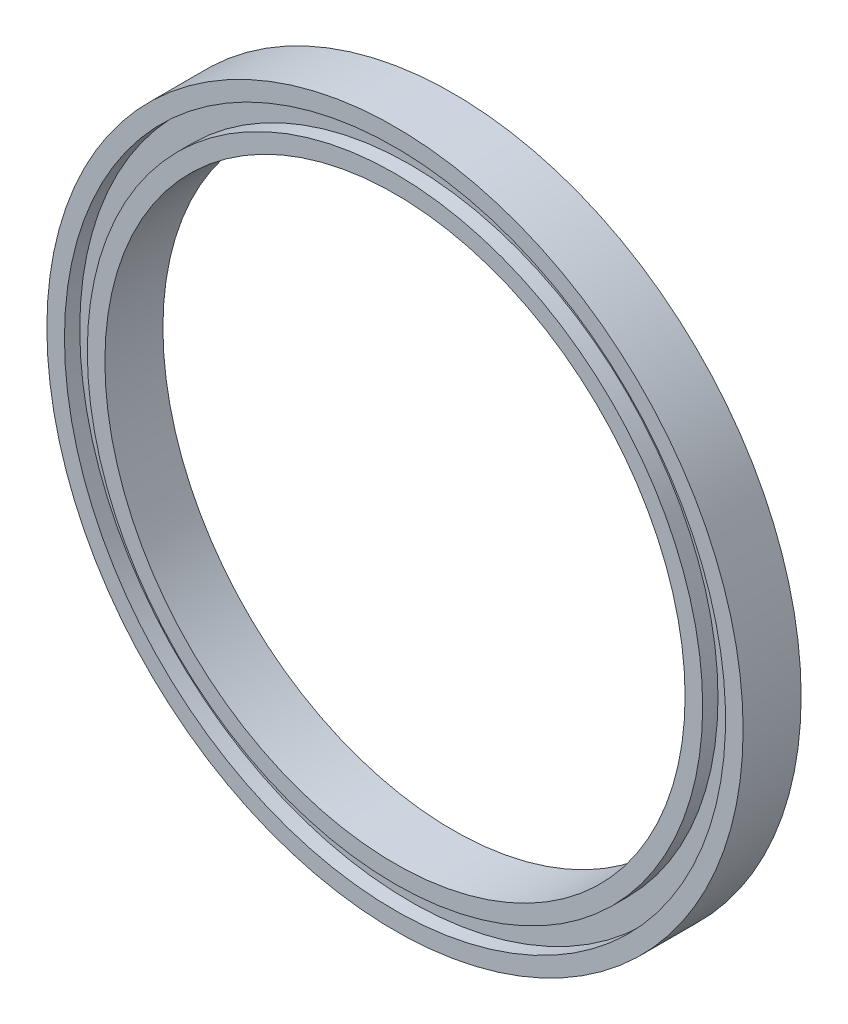
ISO-10303-21;
HEADER;
FILE_DESCRIPTION(('STEP AP214'),'2;1');
FILE_NAME('part.step','',(''),(''),'','','');
FILE_SCHEMA(('AUTOMOTIVE_DESIGN { 1 0 10303 214 1 1 1 1 }'));
ENDSEC;
DATA;
#1=APPLICATION_CONTEXT('core data for automotive mechanical design processes');
#2=APPLICATION_PROTOCOL_DEFINITION('international standard','automotive_design',2000,#1);
#3=PRODUCT_CONTEXT('',#1,'mechanical');
#4=PRODUCT('Part','Part','',(#3));
#5=PRODUCT_RELATED_PRODUCT_CATEGORY('part','',(#4));
#6=PRODUCT_DEFINITION_FORMATION('','',#4);
#7=PRODUCT_DEFINITION_CONTEXT('part definition',#1,'design');
#8=PRODUCT_DEFINITION('design','',#6,#7);
#9=PRODUCT_DEFINITION_SHAPE('','',#8);
#10=(LENGTH_UNIT() NAMED_UNIT(*) SI_UNIT(.MILLI.,.METRE.));
#11=(NAMED_UNIT(*) PLANE_ANGLE_UNIT() SI_UNIT($,.RADIAN.));
#12=(NAMED_UNIT(*) SI_UNIT($,.STERADIAN.) SOLID_ANGLE_UNIT());
#13=UNCERTAINTY_MEASURE_WITH_UNIT(LENGTH_MEASURE(1.E-05),#10,'distance_accuracy_value','');
#14=(GEOMETRIC_REPRESENTATION_CONTEXT(3) GLOBAL_UNCERTAINTY_ASSIGNED_CONTEXT((#13)) GLOBAL_UNIT_ASSIGNED_CONTEXT((#10,
#11,#12)) REPRESENTATION_CONTEXT('',''));
#15=CARTESIAN_POINT('',(0.,0.,0.));
#16=DIRECTION('',(0.,0.,1.));
#17=DIRECTION('',(1.,0.,0.));
#18=AXIS2_PLACEMENT_3D('',#15,#16,#17);
#19=CARTESIAN_POINT('',(0.,38.1,-3.175));
#20=DIRECTION('',(0.,0.,-1.));
#21=DIRECTION('',(-1.,0.,0.));
#22=AXIS2_PLACEMENT_3D('',#19,#20,#21);
#23=PLANE('',#22);
#24=CARTESIAN_POINT('',(0.,0.,-3.175));
#25=DIRECTION('',(0.,0.,-1.));
#26=DIRECTION('',(-1.,0.,0.));
#27=AXIS2_PLACEMENT_3D('',#24,#25,#26);
#28=CIRCLE('',#27,38.1);
#29=CARTESIAN_POINT('',(-38.1,0.,-3.175));
#30=VERTEX_POINT('',#29);
#31=EDGE_CURVE('E85',#30,#30,#28,.T.);
#32=ORIENTED_EDGE('',*,*,#31,.T.);
#33=EDGE_LOOP('',(#32));
#34=FACE_BOUND('',#33,.T.);
#35=CARTESIAN_POINT('',(0.,0.,-3.175));
#36=DIRECTION('',(0.,0.,-1.));
#37=DIRECTION('',(-1.,0.,0.));
#38=AXIS2_PLACEMENT_3D('',#35,#36,#37);
#39=CIRCLE('',#38,36.175);
#40=CARTESIAN_POINT('',(-36.175,0.,-3.175));
#41=VERTEX_POINT('',#40);
#42=EDGE_CURVE('E10',#41,#41,#39,.T.);
#43=ORIENTED_EDGE('',*,*,#42,.F.);
#44=EDGE_LOOP('',(#43));
#45=FACE_BOUND('',#44,.T.);
#46=ADVANCED_FACE('F45',(#34,#45),#23,.T.);
#47=CARTESIAN_POINT('',(0.,0.,0.));
#48=DIRECTION('',(0.,0.,-1.));
#49=DIRECTION('',(-1.,0.,0.));
#50=AXIS2_PLACEMENT_3D('',#47,#48,#49);
#51=CYLINDRICAL_SURFACE('',#50,36.175);
#52=ORIENTED_EDGE('',*,*,#42,.T.);
#53=EDGE_LOOP('',(#52));
#54=FACE_BOUND('',#53,.T.);
#55=CARTESIAN_POINT('',(0.,0.,-1.5));
#56=DIRECTION('',(0.,0.,-1.));
#57=DIRECTION('',(-1.,0.,0.));
#58=AXIS2_PLACEMENT_3D('',#55,#56,#57);
#59=CIRCLE('',#58,36.175);
#60=CARTESIAN_POINT('',(-36.175,0.,-1.5));
#61=VERTEX_POINT('',#60);
#62=EDGE_CURVE('E51',#61,#61,#59,.T.);
#63=ORIENTED_EDGE('',*,*,#62,.F.);
#64=EDGE_LOOP('',(#63));
#65=FACE_BOUND('',#64,.T.);
#66=ADVANCED_FACE('F103',(#54,#65),#51,.F.);
#67=CARTESIAN_POINT('',(0.,36.175,-1.5));
#68=DIRECTION('',(0.,0.,-1.));
#69=DIRECTION('',(-1.,0.,0.));
#70=AXIS2_PLACEMENT_3D('',#67,#68,#69);
#71=PLANE('',#70);
#72=ORIENTED_EDGE('',*,*,#62,.T.);
#73=EDGE_LOOP('',(#72));
#74=FACE_BOUND('',#73,.T.);
#75=CARTESIAN_POINT('',(0.,0.,-1.5));
#76=DIRECTION('',(0.,0.,-1.));
#77=DIRECTION('',(-1.,0.,0.));
#78=AXIS2_PLACEMENT_3D('',#75,#76,#77);
#79=CIRCLE('',#78,33.675);
#80=CARTESIAN_POINT('',(-33.675,0.,-1.5));
#81=VERTEX_POINT('',#80);
#82=EDGE_CURVE('E55',#81,#81,#79,.T.);
#83=ORIENTED_EDGE('',*,*,#82,.F.);
#84=EDGE_LOOP('',(#83));
#85=FACE_BOUND('',#84,.T.);
#86=ADVANCED_FACE('F107',(#74,#85),#71,.T.);
#87=CARTESIAN_POINT('',(0.,0.,0.));
#88=DIRECTION('',(0.,0.,-1.));
#89=DIRECTION('',(-1.,0.,0.));
#90=AXIS2_PLACEMENT_3D('',#87,#88,#89);
#91=CYLINDRICAL_SURFACE('',#90,33.675);
#92=ORIENTED_EDGE('',*,*,#82,.T.);
#93=EDGE_LOOP('',(#92));
#94=FACE_BOUND('',#93,.T.);
#95=CARTESIAN_POINT('',(0.,0.,-3.175));
#96=DIRECTION('',(0.,0.,-1.));
#97=DIRECTION('',(-1.,0.,0.));
#98=AXIS2_PLACEMENT_3D('',#95,#96,#97);
#99=CIRCLE('',#98,33.675);
#100=CARTESIAN_POINT('',(-33.675,0.,-3.175));
#101=VERTEX_POINT('',#100);
#102=EDGE_CURVE('E59',#101,#101,#99,.T.);
#103=ORIENTED_EDGE('',*,*,#102,.F.);
#104=EDGE_LOOP('',(#103));
#105=FACE_BOUND('',#104,.T.);
#106=ADVANCED_FACE('F112',(#94,#105),#91,.T.);
#107=CARTESIAN_POINT('',(0.,31.75,-3.175));
#108=DIRECTION('',(0.,0.,-1.));
#109=DIRECTION('',(-1.,0.,0.));
#110=AXIS2_PLACEMENT_3D('',#107,#108,#109);
#111=PLANE('',#110);
#112=ORIENTED_EDGE('',*,*,#102,.T.);
#113=EDGE_LOOP('',(#112));
#114=FACE_BOUND('',#113,.T.);
#115=CARTESIAN_POINT('',(0.,0.,-3.175));
#116=DIRECTION('',(0.,0.,-1.));
#117=DIRECTION('',(-1.,0.,0.));
#118=AXIS2_PLACEMENT_3D('',#115,#116,#117);
#119=CIRCLE('',#118,31.75);
#120=CARTESIAN_POINT('',(-31.75,0.,-3.175));
#121=VERTEX_POINT('',#120);
#122=EDGE_CURVE('E64',#121,#121,#119,.T.);
#123=ORIENTED_EDGE('',*,*,#122,.F.);
#124=EDGE_LOOP('',(#123));
#125=FACE_BOUND('',#124,.T.);
#126=ADVANCED_FACE('F118',(#114,#125),#111,.T.);
#127=CARTESIAN_POINT('',(0.,0.,0.));
#128=DIRECTION('',(0.,0.,-1.));
#129=DIRECTION('',(-1.,0.,0.));
#130=AXIS2_PLACEMENT_3D('',#127,#128,#129);
#131=CYLINDRICAL_SURFACE('',#130,31.75);
#132=ORIENTED_EDGE('',*,*,#122,.T.);
#133=EDGE_LOOP('',(#132));
#134=FACE_BOUND('',#133,.T.);
#135=CARTESIAN_POINT('',(0.,0.,3.175));
#136=DIRECTION('',(0.,0.,-1.));
#137=DIRECTION('',(-1.,0.,0.));
#138=AXIS2_PLACEMENT_3D('',#135,#136,#137);
#139=CIRCLE('',#138,31.75);
#140=CARTESIAN_POINT('',(-31.75,0.,3.175));
#141=VERTEX_POINT('',#140);
#142=EDGE_CURVE('E67',#141,#141,#139,.T.);
#143=ORIENTED_EDGE('',*,*,#142,.F.);
#144=EDGE_LOOP('',(#143));
#145=FACE_BOUND('',#144,.T.);
#146=ADVANCED_FACE('F122',(#134,#145),#131,.F.);
#147=CARTESIAN_POINT('',(0.,31.75,3.175));
#148=DIRECTION('',(0.,0.,1.));
#149=DIRECTION('',(1.,0.,0.));
#150=AXIS2_PLACEMENT_3D('',#147,#148,#149);
#151=PLANE('',#150);
#152=ORIENTED_EDGE('',*,*,#142,.T.);
#153=EDGE_LOOP('',(#152));
#154=FACE_BOUND('',#153,.T.);
#155=CARTESIAN_POINT('',(0.,0.,3.175));
#156=DIRECTION('',(0.,0.,-1.));
#157=DIRECTION('',(-1.,0.,0.));
#158=AXIS2_PLACEMENT_3D('',#155,#156,#157);
#159=CIRCLE('',#158,33.675);
#160=CARTESIAN_POINT('',(-33.675,0.,3.175));
#161=VERTEX_POINT('',#160);
#162=EDGE_CURVE('E70',#161,#161,#159,.T.);
#163=ORIENTED_EDGE('',*,*,#162,.F.);
#164=EDGE_LOOP('',(#163));
#165=FACE_BOUND('',#164,.T.);
#166=ADVANCED_FACE('F126',(#154,#165),#151,.T.);
#167=CARTESIAN_POINT('',(0.,0.,0.));
#168=DIRECTION('',(0.,0.,-1.));
#169=DIRECTION('',(-1.,0.,0.));
#170=AXIS2_PLACEMENT_3D('',#167,#168,#169);
#171=CYLINDRICAL_SURFACE('',#170,33.675);
#172=ORIENTED_EDGE('',*,*,#162,.T.);
#173=EDGE_LOOP('',(#172));
#174=FACE_BOUND('',#173,.T.);
#175=CARTESIAN_POINT('',(0.,0.,1.5));
#176=DIRECTION('',(0.,0.,-1.));
#177=DIRECTION('',(-1.,0.,0.));
#178=AXIS2_PLACEMENT_3D('',#175,#176,#177);
#179=CIRCLE('',#178,33.675);
#180=CARTESIAN_POINT('',(-33.675,0.,1.5));
#181=VERTEX_POINT('',#180);
#182=EDGE_CURVE('E73',#181,#181,#179,.T.);
#183=ORIENTED_EDGE('',*,*,#182,.F.);
#184=EDGE_LOOP('',(#183));
#185=FACE_BOUND('',#184,.T.);
#186=ADVANCED_FACE('F130',(#174,#185),#171,.T.);
#187=CARTESIAN_POINT('',(0.,36.175,1.5));
#188=DIRECTION('',(0.,0.,1.));
#189=DIRECTION('',(1.,0.,0.));
#190=AXIS2_PLACEMENT_3D('',#187,#188,#189);
#191=PLANE('',#190);
#192=ORIENTED_EDGE('',*,*,#182,.T.);
#193=EDGE_LOOP('',(#192));
#194=FACE_BOUND('',#193,.T.);
#195=CARTESIAN_POINT('',(0.,0.,1.5));
#196=DIRECTION('',(0.,0.,-1.));
#197=DIRECTION('',(-1.,0.,0.));
#198=AXIS2_PLACEMENT_3D('',#195,#196,#197);
#199=CIRCLE('',#198,36.175);
#200=CARTESIAN_POINT('',(-36.175,0.,1.5));
#201=VERTEX_POINT('',#200);
#202=EDGE_CURVE('E76',#201,#201,#199,.T.);
#203=ORIENTED_EDGE('',*,*,#202,.F.);
#204=EDGE_LOOP('',(#203));
#205=FACE_BOUND('',#204,.T.);
#206=ADVANCED_FACE('F134',(#194,#205),#191,.T.);
#207=CARTESIAN_POINT('',(0.,0.,0.));
#208=DIRECTION('',(0.,0.,-1.));
#209=DIRECTION('',(-1.,0.,0.));
#210=AXIS2_PLACEMENT_3D('',#207,#208,#209);
#211=CYLINDRICAL_SURFACE('',#210,36.175);
#212=ORIENTED_EDGE('',*,*,#202,.T.);
#213=EDGE_LOOP('',(#212));
#214=FACE_BOUND('',#213,.T.);
#215=CARTESIAN_POINT('',(0.,0.,3.175));
#216=DIRECTION('',(0.,0.,-1.));
#217=DIRECTION('',(-1.,0.,0.));
#218=AXIS2_PLACEMENT_3D('',#215,#216,#217);
#219=CIRCLE('',#218,36.175);
#220=CARTESIAN_POINT('',(-36.175,0.,3.175));
#221=VERTEX_POINT('',#220);
#222=EDGE_CURVE('E79',#221,#221,#219,.T.);
#223=ORIENTED_EDGE('',*,*,#222,.F.);
#224=EDGE_LOOP('',(#223));
#225=FACE_BOUND('',#224,.T.);
#226=ADVANCED_FACE('F99',(#214,#225),#211,.F.);
#227=CARTESIAN_POINT('',(0.,38.1,3.175));
#228=DIRECTION('',(0.,0.,1.));
#229=DIRECTION('',(1.,0.,0.));
#230=AXIS2_PLACEMENT_3D('',#227,#228,#229);
#231=PLANE('',#230);
#232=ORIENTED_EDGE('',*,*,#222,.T.);
#233=EDGE_LOOP('',(#232));
#234=FACE_BOUND('',#233,.T.);
#235=CARTESIAN_POINT('',(0.,0.,3.175));
#236=DIRECTION('',(0.,0.,-1.));
#237=DIRECTION('',(-1.,0.,0.));
#238=AXIS2_PLACEMENT_3D('',#235,#236,#237);
#239=CIRCLE('',#238,38.1);
#240=CARTESIAN_POINT('',(-38.1,0.,3.175));
#241=VERTEX_POINT('',#240);
#242=EDGE_CURVE('E82',#241,#241,#239,.T.);
#243=ORIENTED_EDGE('',*,*,#242,.F.);
#244=EDGE_LOOP('',(#243));
#245=FACE_BOUND('',#244,.T.);
#246=ADVANCED_FACE('F93',(#234,#245),#231,.T.);
#247=CARTESIAN_POINT('',(0.,0.,0.));
#248=DIRECTION('',(0.,0.,-1.));
#249=DIRECTION('',(-1.,0.,0.));
#250=AXIS2_PLACEMENT_3D('',#247,#248,#249);
#251=CYLINDRICAL_SURFACE('',#250,38.1);
#252=ORIENTED_EDGE('',*,*,#242,.T.);
#253=EDGE_LOOP('',(#252));
#254=FACE_BOUND('',#253,.T.);
#255=ORIENTED_EDGE('',*,*,#31,.F.);
#256=EDGE_LOOP('',(#255));
#257=FACE_BOUND('',#256,.T.);
#258=ADVANCED_FACE('F91',(#254,#257),#251,.T.);
#259=CLOSED_SHELL('',(#46,#66,#86,#106,#126,#146,#166,#186,#206,#226,#246,#258));
#260=MANIFOLD_SOLID_BREP('B2',#259);
#261=ADVANCED_BREP_SHAPE_REPRESENTATION('',(#18,#260),#14);
#262=SHAPE_DEFINITION_REPRESENTATION(#9,#261);
ENDSEC;
END-ISO-10303-21;
